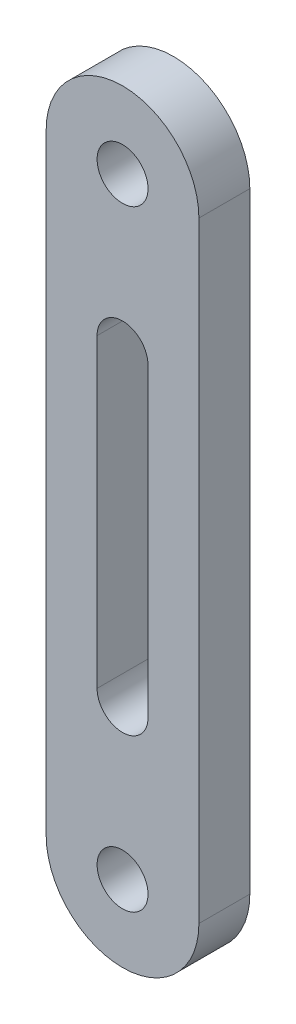
ISO-10303-21;
HEADER;
FILE_DESCRIPTION(('STEP AP214'),'2;1');
FILE_NAME('part.step','',(''),(''),'','','');
FILE_SCHEMA(('AUTOMOTIVE_DESIGN { 1 0 10303 214 1 1 1 1 }'));
ENDSEC;
DATA;
#1=APPLICATION_CONTEXT('core data for automotive mechanical design processes');
#2=APPLICATION_PROTOCOL_DEFINITION('international standard','automotive_design',2000,#1);
#3=PRODUCT_CONTEXT('',#1,'mechanical');
#4=PRODUCT('Part','Part','',(#3));
#5=PRODUCT_RELATED_PRODUCT_CATEGORY('part','',(#4));
#6=PRODUCT_DEFINITION_FORMATION('','',#4);
#7=PRODUCT_DEFINITION_CONTEXT('part definition',#1,'design');
#8=PRODUCT_DEFINITION('design','',#6,#7);
#9=PRODUCT_DEFINITION_SHAPE('','',#8);
#10=(LENGTH_UNIT() NAMED_UNIT(*) SI_UNIT(.MILLI.,.METRE.));
#11=(NAMED_UNIT(*) PLANE_ANGLE_UNIT() SI_UNIT($,.RADIAN.));
#12=(NAMED_UNIT(*) SI_UNIT($,.STERADIAN.) SOLID_ANGLE_UNIT());
#13=UNCERTAINTY_MEASURE_WITH_UNIT(LENGTH_MEASURE(1.E-05),#10,'distance_accuracy_value','');
#14=(GEOMETRIC_REPRESENTATION_CONTEXT(3) GLOBAL_UNCERTAINTY_ASSIGNED_CONTEXT((#13)) GLOBAL_UNIT_ASSIGNED_CONTEXT((#10,
#11,#12)) REPRESENTATION_CONTEXT('',''));
#15=CARTESIAN_POINT('',(0.,0.,0.));
#16=DIRECTION('',(0.,0.,1.));
#17=DIRECTION('',(1.,0.,0.));
#18=AXIS2_PLACEMENT_3D('',#15,#16,#17);
#19=CARTESIAN_POINT('',(208.7507761496,152.428489513,3.));
#20=DIRECTION('',(0.,0.,1.));
#21=DIRECTION('',(1.,0.,0.));
#22=AXIS2_PLACEMENT_3D('',#19,#20,#21);
#23=PLANE('',#22);
#24=CARTESIAN_POINT('',(208.7507761496,152.428489513,3.));
#25=DIRECTION('',(0.,0.,1.));
#26=DIRECTION('',(1.,0.,0.));
#27=AXIS2_PLACEMENT_3D('',#24,#25,#26);
#28=CIRCLE('',#27,1.5);
#29=CARTESIAN_POINT('',(210.2507761496,152.428489513,3.));
#30=VERTEX_POINT('',#29);
#31=EDGE_CURVE('E134',#30,#30,#28,.T.);
#32=ORIENTED_EDGE('',*,*,#31,.F.);
#33=EDGE_LOOP('',(#32));
#34=FACE_BOUND('',#33,.T.);
#35=CARTESIAN_POINT('',(208.7507761496,152.428489513,3.));
#36=DIRECTION('',(0.,0.,1.));
#37=DIRECTION('',(1.,0.,0.));
#38=AXIS2_PLACEMENT_3D('',#35,#36,#37);
#39=CIRCLE('',#38,4.5);
#40=CARTESIAN_POINT('',(204.2507761496,152.428489513,3.));
#41=VERTEX_POINT('',#40);
#42=CARTESIAN_POINT('',(213.2507761496,152.428489513,3.));
#43=VERTEX_POINT('',#42);
#44=EDGE_CURVE('E146',#41,#43,#39,.T.);
#45=ORIENTED_EDGE('',*,*,#44,.T.);
#46=DIRECTION('',(0.,1.,0.));
#47=VECTOR('',#46,1.);
#48=CARTESIAN_POINT('',(213.2507761496,152.428489513,3.));
#49=LINE('',#48,#47);
#50=CARTESIAN_POINT('',(213.2507761496,188.428489513,3.));
#51=VERTEX_POINT('',#50);
#52=EDGE_CURVE('E149',#43,#51,#49,.T.);
#53=ORIENTED_EDGE('',*,*,#52,.T.);
#54=CARTESIAN_POINT('',(208.7507761496,188.428489513,3.));
#55=DIRECTION('',(0.,0.,1.));
#56=DIRECTION('',(1.,0.,0.));
#57=AXIS2_PLACEMENT_3D('',#54,#55,#56);
#58=CIRCLE('',#57,4.5);
#59=CARTESIAN_POINT('',(204.2507761496,188.428489513,3.));
#60=VERTEX_POINT('',#59);
#61=EDGE_CURVE('E152',#51,#60,#58,.T.);
#62=ORIENTED_EDGE('',*,*,#61,.T.);
#63=DIRECTION('',(0.,-1.,0.));
#64=VECTOR('',#63,1.);
#65=CARTESIAN_POINT('',(204.2507761496,188.428489513,3.));
#66=LINE('',#65,#64);
#67=EDGE_CURVE('E154',#60,#41,#66,.T.);
#68=ORIENTED_EDGE('',*,*,#67,.T.);
#69=EDGE_LOOP('',(#45,#53,#62,#68));
#70=FACE_BOUND('',#69,.T.);
#71=CARTESIAN_POINT('',(208.7507761496,188.428489513,3.));
#72=DIRECTION('',(0.,0.,1.));
#73=DIRECTION('',(1.,0.,0.));
#74=AXIS2_PLACEMENT_3D('',#71,#72,#73);
#75=CIRCLE('',#74,1.5);
#76=CARTESIAN_POINT('',(210.2507761496,188.428489513,3.));
#77=VERTEX_POINT('',#76);
#78=EDGE_CURVE('E140',#77,#77,#75,.T.);
#79=ORIENTED_EDGE('',*,*,#78,.F.);
#80=EDGE_LOOP('',(#79));
#81=FACE_BOUND('',#80,.T.);
#82=DIRECTION('',(0.,1.,0.));
#83=VECTOR('',#82,1.);
#84=CARTESIAN_POINT('',(210.2507761496,161.428489513,3.));
#85=LINE('',#84,#83);
#86=CARTESIAN_POINT('',(210.2507761496,161.428489513,3.));
#87=VERTEX_POINT('',#86);
#88=CARTESIAN_POINT('',(210.2507761496,179.428489513,3.));
#89=VERTEX_POINT('',#88);
#90=EDGE_CURVE('E106',#87,#89,#85,.T.);
#91=ORIENTED_EDGE('',*,*,#90,.F.);
#92=CARTESIAN_POINT('',(208.7507761496,161.428489513,3.));
#93=DIRECTION('',(0.,0.,1.));
#94=DIRECTION('',(1.,0.,0.));
#95=AXIS2_PLACEMENT_3D('',#92,#93,#94);
#96=CIRCLE('',#95,1.5);
#97=CARTESIAN_POINT('',(207.2507761496,161.428489513,3.));
#98=VERTEX_POINT('',#97);
#99=EDGE_CURVE('E98',#98,#87,#96,.T.);
#100=ORIENTED_EDGE('',*,*,#99,.F.);
#101=DIRECTION('',(0.,-1.,0.));
#102=VECTOR('',#101,1.);
#103=CARTESIAN_POINT('',(207.2507761496,179.428489513,3.));
#104=LINE('',#103,#102);
#105=CARTESIAN_POINT('',(207.2507761496,179.428489513,3.));
#106=VERTEX_POINT('',#105);
#107=EDGE_CURVE('E120',#106,#98,#104,.T.);
#108=ORIENTED_EDGE('',*,*,#107,.F.);
#109=CARTESIAN_POINT('',(208.7507761496,179.428489513,3.));
#110=DIRECTION('',(0.,0.,1.));
#111=DIRECTION('',(1.,0.,0.));
#112=AXIS2_PLACEMENT_3D('',#109,#110,#111);
#113=CIRCLE('',#112,1.5);
#114=EDGE_CURVE('E118',#89,#106,#113,.T.);
#115=ORIENTED_EDGE('',*,*,#114,.F.);
#116=EDGE_LOOP('',(#91,#100,#108,#115));
#117=FACE_BOUND('',#116,.T.);
#118=ADVANCED_FACE('F33',(#34,#70,#81,#117),#23,.T.);
#119=CARTESIAN_POINT('',(208.7507761496,152.428489513,0.));
#120=DIRECTION('',(0.,0.,1.));
#121=DIRECTION('',(1.,0.,0.));
#122=AXIS2_PLACEMENT_3D('',#119,#120,#121);
#123=PLANE('',#122);
#124=CARTESIAN_POINT('',(208.7507761496,152.428489513,0.));
#125=DIRECTION('',(0.,0.,1.));
#126=DIRECTION('',(1.,0.,0.));
#127=AXIS2_PLACEMENT_3D('',#124,#125,#126);
#128=CIRCLE('',#127,1.5);
#129=CARTESIAN_POINT('',(210.2507761496,152.428489513,0.));
#130=VERTEX_POINT('',#129);
#131=EDGE_CURVE('E114',#130,#130,#128,.T.);
#132=ORIENTED_EDGE('',*,*,#131,.T.);
#133=EDGE_LOOP('',(#132));
#134=FACE_BOUND('',#133,.T.);
#135=CARTESIAN_POINT('',(208.7507761496,152.428489513,0.));
#136=DIRECTION('',(0.,0.,1.));
#137=DIRECTION('',(1.,0.,0.));
#138=AXIS2_PLACEMENT_3D('',#135,#136,#137);
#139=CIRCLE('',#138,4.5);
#140=CARTESIAN_POINT('',(204.2507761496,152.428489513,0.));
#141=VERTEX_POINT('',#140);
#142=CARTESIAN_POINT('',(213.2507761496,152.428489513,0.));
#143=VERTEX_POINT('',#142);
#144=EDGE_CURVE('E143',#141,#143,#139,.T.);
#145=ORIENTED_EDGE('',*,*,#144,.F.);
#146=DIRECTION('',(0.,-1.,0.));
#147=VECTOR('',#146,1.);
#148=CARTESIAN_POINT('',(204.2507761496,188.428489513,0.));
#149=LINE('',#148,#147);
#150=CARTESIAN_POINT('',(204.2507761496,188.428489513,0.));
#151=VERTEX_POINT('',#150);
#152=EDGE_CURVE('E150',#151,#141,#149,.T.);
#153=ORIENTED_EDGE('',*,*,#152,.F.);
#154=CARTESIAN_POINT('',(208.7507761496,188.428489513,0.));
#155=DIRECTION('',(0.,0.,1.));
#156=DIRECTION('',(1.,0.,0.));
#157=AXIS2_PLACEMENT_3D('',#154,#155,#156);
#158=CIRCLE('',#157,4.5);
#159=CARTESIAN_POINT('',(213.2507761496,188.428489513,0.));
#160=VERTEX_POINT('',#159);
#161=EDGE_CURVE('E161',#160,#151,#158,.T.);
#162=ORIENTED_EDGE('',*,*,#161,.F.);
#163=DIRECTION('',(0.,1.,0.));
#164=VECTOR('',#163,1.);
#165=CARTESIAN_POINT('',(213.2507761496,152.428489513,0.));
#166=LINE('',#165,#164);
#167=EDGE_CURVE('E159',#143,#160,#166,.T.);
#168=ORIENTED_EDGE('',*,*,#167,.F.);
#169=EDGE_LOOP('',(#145,#153,#162,#168));
#170=FACE_BOUND('',#169,.T.);
#171=CARTESIAN_POINT('',(208.7507761496,188.428489513,0.));
#172=DIRECTION('',(0.,0.,1.));
#173=DIRECTION('',(1.,0.,0.));
#174=AXIS2_PLACEMENT_3D('',#171,#172,#173);
#175=CIRCLE('',#174,1.5);
#176=CARTESIAN_POINT('',(210.2507761496,188.428489513,0.));
#177=VERTEX_POINT('',#176);
#178=EDGE_CURVE('E137',#177,#177,#175,.T.);
#179=ORIENTED_EDGE('',*,*,#178,.T.);
#180=EDGE_LOOP('',(#179));
#181=FACE_BOUND('',#180,.T.);
#182=CARTESIAN_POINT('',(208.7507761496,161.428489513,0.));
#183=DIRECTION('',(0.,0.,1.));
#184=DIRECTION('',(1.,0.,0.));
#185=AXIS2_PLACEMENT_3D('',#182,#183,#184);
#186=CIRCLE('',#185,1.5);
#187=CARTESIAN_POINT('',(207.2507761496,161.428489513,0.));
#188=VERTEX_POINT('',#187);
#189=CARTESIAN_POINT('',(210.2507761496,161.428489513,0.));
#190=VERTEX_POINT('',#189);
#191=EDGE_CURVE('E56',#188,#190,#186,.T.);
#192=ORIENTED_EDGE('',*,*,#191,.T.);
#193=DIRECTION('',(0.,1.,0.));
#194=VECTOR('',#193,1.);
#195=CARTESIAN_POINT('',(210.2507761496,161.428489513,0.));
#196=LINE('',#195,#194);
#197=CARTESIAN_POINT('',(210.2507761496,179.428489513,0.));
#198=VERTEX_POINT('',#197);
#199=EDGE_CURVE('E113',#190,#198,#196,.T.);
#200=ORIENTED_EDGE('',*,*,#199,.T.);
#201=CARTESIAN_POINT('',(208.7507761496,179.428489513,0.));
#202=DIRECTION('',(0.,0.,1.));
#203=DIRECTION('',(1.,0.,0.));
#204=AXIS2_PLACEMENT_3D('',#201,#202,#203);
#205=CIRCLE('',#204,1.5);
#206=CARTESIAN_POINT('',(207.2507761496,179.428489513,0.));
#207=VERTEX_POINT('',#206);
#208=EDGE_CURVE('E126',#198,#207,#205,.T.);
#209=ORIENTED_EDGE('',*,*,#208,.T.);
#210=DIRECTION('',(0.,-1.,0.));
#211=VECTOR('',#210,1.);
#212=CARTESIAN_POINT('',(207.2507761496,179.428489513,0.));
#213=LINE('',#212,#211);
#214=EDGE_CURVE('E107',#207,#188,#213,.T.);
#215=ORIENTED_EDGE('',*,*,#214,.T.);
#216=EDGE_LOOP('',(#192,#200,#209,#215));
#217=FACE_BOUND('',#216,.T.);
#218=ADVANCED_FACE('F179',(#134,#170,#181,#217),#123,.F.);
#219=CARTESIAN_POINT('',(208.7507761496,152.428489513,3.));
#220=DIRECTION('',(0.,0.,-1.));
#221=DIRECTION('',(-1.,0.,0.));
#222=AXIS2_PLACEMENT_3D('',#219,#220,#221);
#223=CYLINDRICAL_SURFACE('',#222,4.5);
#224=ORIENTED_EDGE('',*,*,#144,.T.);
#225=DIRECTION('',(0.,0.,-1.));
#226=VECTOR('',#225,1.);
#227=CARTESIAN_POINT('',(213.2507761496,152.428489513,3.));
#228=LINE('',#227,#226);
#229=EDGE_CURVE('E11',#43,#143,#228,.T.);
#230=ORIENTED_EDGE('',*,*,#229,.F.);
#231=ORIENTED_EDGE('',*,*,#44,.F.);
#232=DIRECTION('',(0.,0.,-1.));
#233=VECTOR('',#232,1.);
#234=CARTESIAN_POINT('',(204.2507761496,152.428489513,3.));
#235=LINE('',#234,#233);
#236=EDGE_CURVE('E156',#41,#141,#235,.T.);
#237=ORIENTED_EDGE('',*,*,#236,.T.);
#238=EDGE_LOOP('',(#224,#230,#231,#237));
#239=FACE_BOUND('',#238,.T.);
#240=ADVANCED_FACE('F35',(#239),#223,.T.);
#241=CARTESIAN_POINT('',(213.2507761496,152.428489513,3.));
#242=DIRECTION('',(-1.,0.,0.));
#243=DIRECTION('',(0.,0.,1.));
#244=AXIS2_PLACEMENT_3D('',#241,#242,#243);
#245=PLANE('',#244);
#246=ORIENTED_EDGE('',*,*,#167,.T.);
#247=DIRECTION('',(0.,0.,-1.));
#248=VECTOR('',#247,1.);
#249=CARTESIAN_POINT('',(213.2507761496,188.428489513,3.));
#250=LINE('',#249,#248);
#251=EDGE_CURVE('E41',#51,#160,#250,.T.);
#252=ORIENTED_EDGE('',*,*,#251,.F.);
#253=ORIENTED_EDGE('',*,*,#52,.F.);
#254=ORIENTED_EDGE('',*,*,#229,.T.);
#255=EDGE_LOOP('',(#246,#252,#253,#254));
#256=FACE_BOUND('',#255,.T.);
#257=ADVANCED_FACE('F190',(#256),#245,.F.);
#258=CARTESIAN_POINT('',(208.7507761496,188.428489513,3.));
#259=DIRECTION('',(0.,0.,-1.));
#260=DIRECTION('',(-1.,0.,0.));
#261=AXIS2_PLACEMENT_3D('',#258,#259,#260);
#262=CYLINDRICAL_SURFACE('',#261,4.5);
#263=ORIENTED_EDGE('',*,*,#161,.T.);
#264=DIRECTION('',(0.,0.,-1.));
#265=VECTOR('',#264,1.);
#266=CARTESIAN_POINT('',(204.2507761496,188.428489513,3.));
#267=LINE('',#266,#265);
#268=EDGE_CURVE('E166',#60,#151,#267,.T.);
#269=ORIENTED_EDGE('',*,*,#268,.F.);
#270=ORIENTED_EDGE('',*,*,#61,.F.);
#271=ORIENTED_EDGE('',*,*,#251,.T.);
#272=EDGE_LOOP('',(#263,#269,#270,#271));
#273=FACE_BOUND('',#272,.T.);
#274=ADVANCED_FACE('F173',(#273),#262,.T.);
#275=CARTESIAN_POINT('',(204.2507761496,188.428489513,3.));
#276=DIRECTION('',(1.,0.,0.));
#277=DIRECTION('',(0.,0.,-1.));
#278=AXIS2_PLACEMENT_3D('',#275,#276,#277);
#279=PLANE('',#278);
#280=ORIENTED_EDGE('',*,*,#152,.T.);
#281=ORIENTED_EDGE('',*,*,#236,.F.);
#282=ORIENTED_EDGE('',*,*,#67,.F.);
#283=ORIENTED_EDGE('',*,*,#268,.T.);
#284=EDGE_LOOP('',(#280,#281,#282,#283));
#285=FACE_BOUND('',#284,.T.);
#286=ADVANCED_FACE('F183',(#285),#279,.F.);
#287=CARTESIAN_POINT('',(208.7507761496,188.428489513,3.));
#288=DIRECTION('',(0.,0.,-1.));
#289=DIRECTION('',(-1.,0.,0.));
#290=AXIS2_PLACEMENT_3D('',#287,#288,#289);
#291=CYLINDRICAL_SURFACE('',#290,1.5);
#292=ORIENTED_EDGE('',*,*,#78,.T.);
#293=EDGE_LOOP('',(#292));
#294=FACE_BOUND('',#293,.T.);
#295=ORIENTED_EDGE('',*,*,#178,.F.);
#296=EDGE_LOOP('',(#295));
#297=FACE_BOUND('',#296,.T.);
#298=ADVANCED_FACE('F207',(#294,#297),#291,.F.);
#299=CARTESIAN_POINT('',(208.7507761496,152.428489513,3.));
#300=DIRECTION('',(0.,0.,-1.));
#301=DIRECTION('',(-1.,0.,0.));
#302=AXIS2_PLACEMENT_3D('',#299,#300,#301);
#303=CYLINDRICAL_SURFACE('',#302,1.5);
#304=ORIENTED_EDGE('',*,*,#31,.T.);
#305=EDGE_LOOP('',(#304));
#306=FACE_BOUND('',#305,.T.);
#307=ORIENTED_EDGE('',*,*,#131,.F.);
#308=EDGE_LOOP('',(#307));
#309=FACE_BOUND('',#308,.T.);
#310=ADVANCED_FACE('F214',(#306,#309),#303,.F.);
#311=CARTESIAN_POINT('',(208.7507761496,161.428489513,3.));
#312=DIRECTION('',(0.,0.,-1.));
#313=DIRECTION('',(-1.,0.,0.));
#314=AXIS2_PLACEMENT_3D('',#311,#312,#313);
#315=CYLINDRICAL_SURFACE('',#314,1.5);
#316=ORIENTED_EDGE('',*,*,#191,.F.);
#317=DIRECTION('',(0.,0.,-1.));
#318=VECTOR('',#317,1.);
#319=CARTESIAN_POINT('',(207.2507761496,161.428489513,3.));
#320=LINE('',#319,#318);
#321=EDGE_CURVE('E102',#98,#188,#320,.T.);
#322=ORIENTED_EDGE('',*,*,#321,.F.);
#323=ORIENTED_EDGE('',*,*,#99,.T.);
#324=DIRECTION('',(0.,0.,-1.));
#325=VECTOR('',#324,1.);
#326=CARTESIAN_POINT('',(210.2507761496,161.428489513,3.));
#327=LINE('',#326,#325);
#328=EDGE_CURVE('E101',#87,#190,#327,.T.);
#329=ORIENTED_EDGE('',*,*,#328,.T.);
#330=EDGE_LOOP('',(#316,#322,#323,#329));
#331=FACE_BOUND('',#330,.T.);
#332=ADVANCED_FACE('F100',(#331),#315,.F.);
#333=CARTESIAN_POINT('',(210.2507761496,161.428489513,3.));
#334=DIRECTION('',(-1.,0.,0.));
#335=DIRECTION('',(0.,0.,1.));
#336=AXIS2_PLACEMENT_3D('',#333,#334,#335);
#337=PLANE('',#336);
#338=ORIENTED_EDGE('',*,*,#199,.F.);
#339=ORIENTED_EDGE('',*,*,#328,.F.);
#340=ORIENTED_EDGE('',*,*,#90,.T.);
#341=DIRECTION('',(0.,0.,-1.));
#342=VECTOR('',#341,1.);
#343=CARTESIAN_POINT('',(210.2507761496,179.428489513,3.));
#344=LINE('',#343,#342);
#345=EDGE_CURVE('E115',#89,#198,#344,.T.);
#346=ORIENTED_EDGE('',*,*,#345,.T.);
#347=EDGE_LOOP('',(#338,#339,#340,#346));
#348=FACE_BOUND('',#347,.T.);
#349=ADVANCED_FACE('F110',(#348),#337,.T.);
#350=CARTESIAN_POINT('',(208.7507761496,179.428489513,3.));
#351=DIRECTION('',(0.,0.,-1.));
#352=DIRECTION('',(-1.,0.,0.));
#353=AXIS2_PLACEMENT_3D('',#350,#351,#352);
#354=CYLINDRICAL_SURFACE('',#353,1.5);
#355=ORIENTED_EDGE('',*,*,#208,.F.);
#356=ORIENTED_EDGE('',*,*,#345,.F.);
#357=ORIENTED_EDGE('',*,*,#114,.T.);
#358=DIRECTION('',(0.,0.,-1.));
#359=VECTOR('',#358,1.);
#360=CARTESIAN_POINT('',(207.2507761496,179.428489513,3.));
#361=LINE('',#360,#359);
#362=EDGE_CURVE('E48',#106,#207,#361,.T.);
#363=ORIENTED_EDGE('',*,*,#362,.T.);
#364=EDGE_LOOP('',(#355,#356,#357,#363));
#365=FACE_BOUND('',#364,.T.);
#366=ADVANCED_FACE('F227',(#365),#354,.F.);
#367=CARTESIAN_POINT('',(207.2507761496,179.428489513,3.));
#368=DIRECTION('',(1.,0.,0.));
#369=DIRECTION('',(0.,0.,-1.));
#370=AXIS2_PLACEMENT_3D('',#367,#368,#369);
#371=PLANE('',#370);
#372=ORIENTED_EDGE('',*,*,#214,.F.);
#373=ORIENTED_EDGE('',*,*,#362,.F.);
#374=ORIENTED_EDGE('',*,*,#107,.T.);
#375=ORIENTED_EDGE('',*,*,#321,.T.);
#376=EDGE_LOOP('',(#372,#373,#374,#375));
#377=FACE_BOUND('',#376,.T.);
#378=ADVANCED_FACE('F225',(#377),#371,.T.);
#379=CLOSED_SHELL('',(#118,#218,#240,#257,#274,#286,#298,#310,#332,#349,#366,#378));
#380=MANIFOLD_SOLID_BREP('B2',#379);
#381=ADVANCED_BREP_SHAPE_REPRESENTATION('',(#18,#380),#14);
#382=SHAPE_DEFINITION_REPRESENTATION(#9,#381);
ENDSEC;
END-ISO-10303-21;
